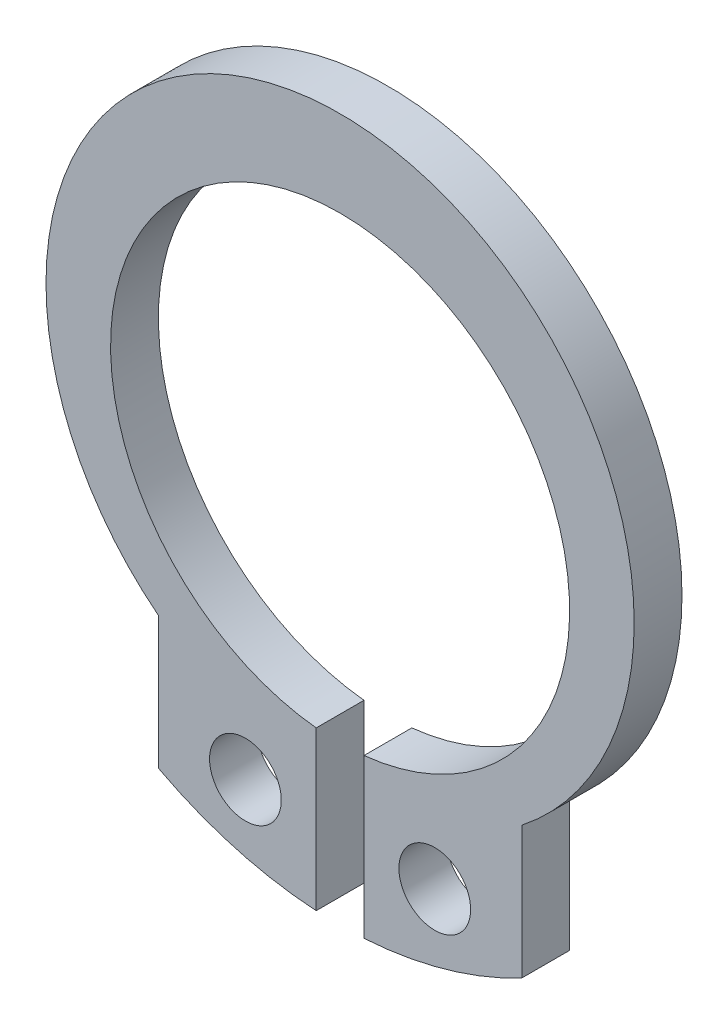
ISO-10303-21;
HEADER;
FILE_DESCRIPTION(('STEP AP214'),'2;1');
FILE_NAME('part.step','',(''),(''),'','','');
FILE_SCHEMA(('AUTOMOTIVE_DESIGN { 1 0 10303 214 1 1 1 1 }'));
ENDSEC;
DATA;
#1=APPLICATION_CONTEXT('core data for automotive mechanical design processes');
#2=APPLICATION_PROTOCOL_DEFINITION('international standard','automotive_design',2000,#1);
#3=PRODUCT_CONTEXT('',#1,'mechanical');
#4=PRODUCT('Part','Part','',(#3));
#5=PRODUCT_RELATED_PRODUCT_CATEGORY('part','',(#4));
#6=PRODUCT_DEFINITION_FORMATION('','',#4);
#7=PRODUCT_DEFINITION_CONTEXT('part definition',#1,'design');
#8=PRODUCT_DEFINITION('design','',#6,#7);
#9=PRODUCT_DEFINITION_SHAPE('','',#8);
#10=(LENGTH_UNIT() NAMED_UNIT(*) SI_UNIT(.MILLI.,.METRE.));
#11=(NAMED_UNIT(*) PLANE_ANGLE_UNIT() SI_UNIT($,.RADIAN.));
#12=(NAMED_UNIT(*) SI_UNIT($,.STERADIAN.) SOLID_ANGLE_UNIT());
#13=UNCERTAINTY_MEASURE_WITH_UNIT(LENGTH_MEASURE(1.E-05),#10,'distance_accuracy_value','');
#14=(GEOMETRIC_REPRESENTATION_CONTEXT(3) GLOBAL_UNCERTAINTY_ASSIGNED_CONTEXT((#13)) GLOBAL_UNIT_ASSIGNED_CONTEXT((#10,
#11,#12)) REPRESENTATION_CONTEXT('',''));
#15=CARTESIAN_POINT('',(0.,0.,0.));
#16=DIRECTION('',(0.,0.,1.));
#17=DIRECTION('',(1.,0.,0.));
#18=AXIS2_PLACEMENT_3D('',#15,#16,#17);
#19=CARTESIAN_POINT('',(0.,0.,0.));
#20=DIRECTION('',(0.,0.,1.));
#21=DIRECTION('',(1.,0.,0.));
#22=AXIS2_PLACEMENT_3D('',#19,#20,#21);
#23=CYLINDRICAL_SURFACE('',#22,8.1);
#24=CARTESIAN_POINT('',(0.,0.,1.));
#25=DIRECTION('',(0.,0.,1.));
#26=DIRECTION('',(1.,0.,0.));
#27=AXIS2_PLACEMENT_3D('',#24,#25,#26);
#28=CIRCLE('',#27,8.1);
#29=CARTESIAN_POINT('',(-3.8,-7.15332090710322,1.));
#30=VERTEX_POINT('',#29);
#31=CARTESIAN_POINT('',(-0.5,-8.08455317256309,1.));
#32=VERTEX_POINT('',#31);
#33=EDGE_CURVE('E142',#30,#32,#28,.T.);
#34=ORIENTED_EDGE('',*,*,#33,.F.);
#35=DIRECTION('',(0.,0.,1.));
#36=VECTOR('',#35,1.);
#37=CARTESIAN_POINT('',(-3.8,-7.15332090710322,0.));
#38=LINE('',#37,#36);
#39=CARTESIAN_POINT('',(-3.8,-7.15332090710322,0.));
#40=VERTEX_POINT('',#39);
#41=EDGE_CURVE('E11',#40,#30,#38,.T.);
#42=ORIENTED_EDGE('',*,*,#41,.F.);
#43=CARTESIAN_POINT('',(0.,0.,0.));
#44=DIRECTION('',(0.,0.,1.));
#45=DIRECTION('',(1.,0.,0.));
#46=AXIS2_PLACEMENT_3D('',#43,#44,#45);
#47=CIRCLE('',#46,8.1);
#48=CARTESIAN_POINT('',(-0.5,-8.08455317256309,0.));
#49=VERTEX_POINT('',#48);
#50=EDGE_CURVE('E163',#40,#49,#47,.T.);
#51=ORIENTED_EDGE('',*,*,#50,.T.);
#52=DIRECTION('',(0.,0.,1.));
#53=VECTOR('',#52,1.);
#54=CARTESIAN_POINT('',(-0.5,-8.08455317256309,0.));
#55=LINE('',#54,#53);
#56=EDGE_CURVE('E48',#49,#32,#55,.T.);
#57=ORIENTED_EDGE('',*,*,#56,.T.);
#58=EDGE_LOOP('',(#34,#42,#51,#57));
#59=FACE_BOUND('',#58,.T.);
#60=ADVANCED_FACE('F45',(#59),#23,.T.);
#61=CARTESIAN_POINT('',(-3.8,-4.38554547078197,0.));
#62=DIRECTION('',(-1.,0.,0.));
#63=DIRECTION('',(0.,0.,1.));
#64=AXIS2_PLACEMENT_3D('',#61,#62,#63);
#65=PLANE('',#64);
#66=DIRECTION('',(0.,-1.,0.));
#67=VECTOR('',#66,1.);
#68=CARTESIAN_POINT('',(-3.8,-4.38554547078197,1.));
#69=LINE('',#68,#67);
#70=CARTESIAN_POINT('',(-3.8,-4.38554547078197,1.));
#71=VERTEX_POINT('',#70);
#72=EDGE_CURVE('E161',#71,#30,#69,.T.);
#73=ORIENTED_EDGE('',*,*,#72,.F.);
#74=DIRECTION('',(0.,0.,1.));
#75=VECTOR('',#74,1.);
#76=CARTESIAN_POINT('',(-3.8,-4.38554547078197,0.));
#77=LINE('',#76,#75);
#78=CARTESIAN_POINT('',(-3.8,-4.38554547078197,0.));
#79=VERTEX_POINT('',#78);
#80=EDGE_CURVE('E54',#79,#71,#77,.T.);
#81=ORIENTED_EDGE('',*,*,#80,.F.);
#82=DIRECTION('',(0.,-1.,0.));
#83=VECTOR('',#82,1.);
#84=CARTESIAN_POINT('',(-3.8,-4.38554547078197,0.));
#85=LINE('',#84,#83);
#86=EDGE_CURVE('E132',#79,#40,#85,.T.);
#87=ORIENTED_EDGE('',*,*,#86,.T.);
#88=ORIENTED_EDGE('',*,*,#41,.T.);
#89=EDGE_LOOP('',(#73,#81,#87,#88));
#90=FACE_BOUND('',#89,.T.);
#91=ADVANCED_FACE('F175',(#90),#65,.T.);
#92=CARTESIAN_POINT('',(0.,0.45,0.));
#93=DIRECTION('',(0.,0.,1.));
#94=DIRECTION('',(1.,0.,0.));
#95=AXIS2_PLACEMENT_3D('',#92,#93,#94);
#96=CYLINDRICAL_SURFACE('',#95,6.15);
#97=CARTESIAN_POINT('',(0.,0.45,1.));
#98=DIRECTION('',(0.,0.,1.));
#99=DIRECTION('',(1.,0.,0.));
#100=AXIS2_PLACEMENT_3D('',#97,#98,#99);
#101=CIRCLE('',#100,6.15);
#102=CARTESIAN_POINT('',(3.8,-4.38554547078197,1.));
#103=VERTEX_POINT('',#102);
#104=EDGE_CURVE('E119',#103,#71,#101,.T.);
#105=ORIENTED_EDGE('',*,*,#104,.F.);
#106=DIRECTION('',(0.,0.,1.));
#107=VECTOR('',#106,1.);
#108=CARTESIAN_POINT('',(3.8,-4.38554547078197,0.));
#109=LINE('',#108,#107);
#110=CARTESIAN_POINT('',(3.8,-4.38554547078197,0.));
#111=VERTEX_POINT('',#110);
#112=EDGE_CURVE('E114',#111,#103,#109,.T.);
#113=ORIENTED_EDGE('',*,*,#112,.F.);
#114=CARTESIAN_POINT('',(0.,0.45,0.));
#115=DIRECTION('',(0.,0.,1.));
#116=DIRECTION('',(1.,0.,0.));
#117=AXIS2_PLACEMENT_3D('',#114,#115,#116);
#118=CIRCLE('',#117,6.15);
#119=EDGE_CURVE('E117',#111,#79,#118,.T.);
#120=ORIENTED_EDGE('',*,*,#119,.T.);
#121=ORIENTED_EDGE('',*,*,#80,.T.);
#122=EDGE_LOOP('',(#105,#113,#120,#121));
#123=FACE_BOUND('',#122,.T.);
#124=ADVANCED_FACE('F116',(#123),#96,.T.);
#125=CARTESIAN_POINT('',(3.8,-7.15332090710322,0.));
#126=DIRECTION('',(1.,0.,0.));
#127=DIRECTION('',(0.,0.,-1.));
#128=AXIS2_PLACEMENT_3D('',#125,#126,#127);
#129=PLANE('',#128);
#130=DIRECTION('',(0.,1.,0.));
#131=VECTOR('',#130,1.);
#132=CARTESIAN_POINT('',(3.8,-7.15332090710322,1.));
#133=LINE('',#132,#131);
#134=CARTESIAN_POINT('',(3.8,-7.15332090710322,1.));
#135=VERTEX_POINT('',#134);
#136=EDGE_CURVE('E158',#135,#103,#133,.T.);
#137=ORIENTED_EDGE('',*,*,#136,.F.);
#138=DIRECTION('',(0.,0.,1.));
#139=VECTOR('',#138,1.);
#140=CARTESIAN_POINT('',(3.8,-7.15332090710322,0.));
#141=LINE('',#140,#139);
#142=CARTESIAN_POINT('',(3.8,-7.15332090710322,0.));
#143=VERTEX_POINT('',#142);
#144=EDGE_CURVE('E124',#143,#135,#141,.T.);
#145=ORIENTED_EDGE('',*,*,#144,.F.);
#146=DIRECTION('',(0.,1.,0.));
#147=VECTOR('',#146,1.);
#148=CARTESIAN_POINT('',(3.8,-7.15332090710322,0.));
#149=LINE('',#148,#147);
#150=EDGE_CURVE('E130',#143,#111,#149,.T.);
#151=ORIENTED_EDGE('',*,*,#150,.T.);
#152=ORIENTED_EDGE('',*,*,#112,.T.);
#153=EDGE_LOOP('',(#137,#145,#151,#152));
#154=FACE_BOUND('',#153,.T.);
#155=ADVANCED_FACE('F134',(#154),#129,.T.);
#156=CARTESIAN_POINT('',(0.,0.,0.));
#157=DIRECTION('',(0.,0.,1.));
#158=DIRECTION('',(1.,0.,0.));
#159=AXIS2_PLACEMENT_3D('',#156,#157,#158);
#160=CYLINDRICAL_SURFACE('',#159,8.1);
#161=CARTESIAN_POINT('',(0.,0.,1.));
#162=DIRECTION('',(0.,0.,1.));
#163=DIRECTION('',(1.,0.,0.));
#164=AXIS2_PLACEMENT_3D('',#161,#162,#163);
#165=CIRCLE('',#164,8.1);
#166=CARTESIAN_POINT('',(0.5,-8.08455317256309,1.));
#167=VERTEX_POINT('',#166);
#168=EDGE_CURVE('E155',#167,#135,#165,.T.);
#169=ORIENTED_EDGE('',*,*,#168,.F.);
#170=DIRECTION('',(0.,0.,1.));
#171=VECTOR('',#170,1.);
#172=CARTESIAN_POINT('',(0.5,-8.08455317256309,0.));
#173=LINE('',#172,#171);
#174=CARTESIAN_POINT('',(0.5,-8.08455317256309,0.));
#175=VERTEX_POINT('',#174);
#176=EDGE_CURVE('E167',#175,#167,#173,.T.);
#177=ORIENTED_EDGE('',*,*,#176,.F.);
#178=CARTESIAN_POINT('',(0.,0.,0.));
#179=DIRECTION('',(0.,0.,1.));
#180=DIRECTION('',(1.,0.,0.));
#181=AXIS2_PLACEMENT_3D('',#178,#179,#180);
#182=CIRCLE('',#181,8.1);
#183=EDGE_CURVE('E135',#175,#143,#182,.T.);
#184=ORIENTED_EDGE('',*,*,#183,.T.);
#185=ORIENTED_EDGE('',*,*,#144,.T.);
#186=EDGE_LOOP('',(#169,#177,#184,#185));
#187=FACE_BOUND('',#186,.T.);
#188=ADVANCED_FACE('F188',(#187),#160,.T.);
#189=CARTESIAN_POINT('',(0.5,-4.773887304912,0.));
#190=DIRECTION('',(-1.,0.,0.));
#191=DIRECTION('',(0.,0.,1.));
#192=AXIS2_PLACEMENT_3D('',#189,#190,#191);
#193=PLANE('',#192);
#194=DIRECTION('',(0.,-1.,0.));
#195=VECTOR('',#194,1.);
#196=CARTESIAN_POINT('',(0.5,-4.773887304912,1.));
#197=LINE('',#196,#195);
#198=CARTESIAN_POINT('',(0.500000000000002,-4.773887304912,1.));
#199=VERTEX_POINT('',#198);
#200=EDGE_CURVE('E152',#199,#167,#197,.T.);
#201=ORIENTED_EDGE('',*,*,#200,.F.);
#202=DIRECTION('',(0.,0.,1.));
#203=VECTOR('',#202,1.);
#204=CARTESIAN_POINT('',(0.500000000000002,-4.773887304912,0.));
#205=LINE('',#204,#203);
#206=CARTESIAN_POINT('',(0.500000000000002,-4.773887304912,0.));
#207=VERTEX_POINT('',#206);
#208=EDGE_CURVE('E169',#207,#199,#205,.T.);
#209=ORIENTED_EDGE('',*,*,#208,.F.);
#210=DIRECTION('',(0.,-1.,0.));
#211=VECTOR('',#210,1.);
#212=CARTESIAN_POINT('',(0.5,-4.773887304912,0.));
#213=LINE('',#212,#211);
#214=EDGE_CURVE('E137',#207,#175,#213,.T.);
#215=ORIENTED_EDGE('',*,*,#214,.T.);
#216=ORIENTED_EDGE('',*,*,#176,.T.);
#217=EDGE_LOOP('',(#201,#209,#215,#216));
#218=FACE_BOUND('',#217,.T.);
#219=ADVANCED_FACE('F191',(#218),#193,.T.);
#220=CARTESIAN_POINT('',(0.,0.,0.));
#221=DIRECTION('',(0.,0.,1.));
#222=DIRECTION('',(1.,0.,0.));
#223=AXIS2_PLACEMENT_3D('',#220,#221,#222);
#224=CYLINDRICAL_SURFACE('',#223,4.8);
#225=CARTESIAN_POINT('',(0.,0.,1.));
#226=DIRECTION('',(0.,0.,-1.));
#227=DIRECTION('',(-1.,0.,0.));
#228=AXIS2_PLACEMENT_3D('',#225,#226,#227);
#229=CIRCLE('',#228,4.8);
#230=CARTESIAN_POINT('',(-0.5,-4.773887304912,1.));
#231=VERTEX_POINT('',#230);
#232=EDGE_CURVE('E149',#231,#199,#229,.T.);
#233=ORIENTED_EDGE('',*,*,#232,.F.);
#234=DIRECTION('',(0.,0.,1.));
#235=VECTOR('',#234,1.);
#236=CARTESIAN_POINT('',(-0.5,-4.773887304912,0.));
#237=LINE('',#236,#235);
#238=CARTESIAN_POINT('',(-0.5,-4.773887304912,0.));
#239=VERTEX_POINT('',#238);
#240=EDGE_CURVE('E170',#239,#231,#237,.T.);
#241=ORIENTED_EDGE('',*,*,#240,.F.);
#242=CARTESIAN_POINT('',(0.,0.,0.));
#243=DIRECTION('',(0.,0.,-1.));
#244=DIRECTION('',(-1.,0.,0.));
#245=AXIS2_PLACEMENT_3D('',#242,#243,#244);
#246=CIRCLE('',#245,4.8);
#247=EDGE_CURVE('E237',#239,#207,#246,.T.);
#248=ORIENTED_EDGE('',*,*,#247,.T.);
#249=ORIENTED_EDGE('',*,*,#208,.T.);
#250=EDGE_LOOP('',(#233,#241,#248,#249));
#251=FACE_BOUND('',#250,.T.);
#252=ADVANCED_FACE('F195',(#251),#224,.F.);
#253=CARTESIAN_POINT('',(-0.5,-8.08455317256309,0.));
#254=DIRECTION('',(1.,0.,0.));
#255=DIRECTION('',(0.,0.,-1.));
#256=AXIS2_PLACEMENT_3D('',#253,#254,#255);
#257=PLANE('',#256);
#258=DIRECTION('',(0.,1.,0.));
#259=VECTOR('',#258,1.);
#260=CARTESIAN_POINT('',(-0.5,-8.08455317256309,1.));
#261=LINE('',#260,#259);
#262=EDGE_CURVE('E145',#32,#231,#261,.T.);
#263=ORIENTED_EDGE('',*,*,#262,.F.);
#264=ORIENTED_EDGE('',*,*,#56,.F.);
#265=DIRECTION('',(0.,1.,0.));
#266=VECTOR('',#265,1.);
#267=CARTESIAN_POINT('',(-0.5,-8.08455317256309,0.));
#268=LINE('',#267,#266);
#269=EDGE_CURVE('E235',#49,#239,#268,.T.);
#270=ORIENTED_EDGE('',*,*,#269,.T.);
#271=ORIENTED_EDGE('',*,*,#240,.T.);
#272=EDGE_LOOP('',(#263,#264,#270,#271));
#273=FACE_BOUND('',#272,.T.);
#274=ADVANCED_FACE('F172',(#273),#257,.T.);
#275=CARTESIAN_POINT('',(0.,0.,0.));
#276=DIRECTION('',(0.,0.,1.));
#277=DIRECTION('',(1.,0.,0.));
#278=AXIS2_PLACEMENT_3D('',#275,#276,#277);
#279=PLANE('',#278);
#280=CARTESIAN_POINT('',(-1.98,-6.45,0.));
#281=DIRECTION('',(0.,0.,1.));
#282=DIRECTION('',(-1.,0.,0.));
#283=AXIS2_PLACEMENT_3D('',#280,#281,#282);
#284=CIRCLE('',#283,0.75);
#285=CARTESIAN_POINT('',(-2.73,-6.45,0.));
#286=VERTEX_POINT('',#285);
#287=EDGE_CURVE('E222',#286,#286,#284,.T.);
#288=ORIENTED_EDGE('',*,*,#287,.T.);
#289=EDGE_LOOP('',(#288));
#290=FACE_BOUND('',#289,.T.);
#291=CARTESIAN_POINT('',(1.98,-6.45,0.));
#292=DIRECTION('',(0.,0.,1.));
#293=DIRECTION('',(-1.,0.,0.));
#294=AXIS2_PLACEMENT_3D('',#291,#292,#293);
#295=CIRCLE('',#294,0.75);
#296=CARTESIAN_POINT('',(1.23,-6.45,0.));
#297=VERTEX_POINT('',#296);
#298=EDGE_CURVE('E146',#297,#297,#295,.T.);
#299=ORIENTED_EDGE('',*,*,#298,.T.);
#300=EDGE_LOOP('',(#299));
#301=FACE_BOUND('',#300,.T.);
#302=ORIENTED_EDGE('',*,*,#50,.F.);
#303=ORIENTED_EDGE('',*,*,#86,.F.);
#304=ORIENTED_EDGE('',*,*,#119,.F.);
#305=ORIENTED_EDGE('',*,*,#150,.F.);
#306=ORIENTED_EDGE('',*,*,#183,.F.);
#307=ORIENTED_EDGE('',*,*,#214,.F.);
#308=ORIENTED_EDGE('',*,*,#247,.F.);
#309=ORIENTED_EDGE('',*,*,#269,.F.);
#310=EDGE_LOOP('',(#302,#303,#304,#305,#306,#307,#308,#309));
#311=FACE_BOUND('',#310,.T.);
#312=ADVANCED_FACE('F128',(#290,#301,#311),#279,.F.);
#313=CARTESIAN_POINT('',(0.,0.,1.));
#314=DIRECTION('',(0.,0.,1.));
#315=DIRECTION('',(1.,0.,0.));
#316=AXIS2_PLACEMENT_3D('',#313,#314,#315);
#317=PLANE('',#316);
#318=CARTESIAN_POINT('',(-1.98,-6.45,1.));
#319=DIRECTION('',(0.,0.,1.));
#320=DIRECTION('',(-1.,0.,0.));
#321=AXIS2_PLACEMENT_3D('',#318,#319,#320);
#322=CIRCLE('',#321,0.75);
#323=CARTESIAN_POINT('',(-2.73,-6.45,1.));
#324=VERTEX_POINT('',#323);
#325=EDGE_CURVE('E225',#324,#324,#322,.T.);
#326=ORIENTED_EDGE('',*,*,#325,.F.);
#327=EDGE_LOOP('',(#326));
#328=FACE_BOUND('',#327,.T.);
#329=CARTESIAN_POINT('',(1.98,-6.45,1.));
#330=DIRECTION('',(0.,0.,1.));
#331=DIRECTION('',(-1.,0.,0.));
#332=AXIS2_PLACEMENT_3D('',#329,#330,#331);
#333=CIRCLE('',#332,0.75);
#334=CARTESIAN_POINT('',(1.23,-6.45,1.));
#335=VERTEX_POINT('',#334);
#336=EDGE_CURVE('E227',#335,#335,#333,.T.);
#337=ORIENTED_EDGE('',*,*,#336,.F.);
#338=EDGE_LOOP('',(#337));
#339=FACE_BOUND('',#338,.T.);
#340=ORIENTED_EDGE('',*,*,#33,.T.);
#341=ORIENTED_EDGE('',*,*,#262,.T.);
#342=ORIENTED_EDGE('',*,*,#232,.T.);
#343=ORIENTED_EDGE('',*,*,#200,.T.);
#344=ORIENTED_EDGE('',*,*,#168,.T.);
#345=ORIENTED_EDGE('',*,*,#136,.T.);
#346=ORIENTED_EDGE('',*,*,#104,.T.);
#347=ORIENTED_EDGE('',*,*,#72,.T.);
#348=EDGE_LOOP('',(#340,#341,#342,#343,#344,#345,#346,#347));
#349=FACE_BOUND('',#348,.T.);
#350=ADVANCED_FACE('F174',(#328,#339,#349),#317,.T.);
#351=CARTESIAN_POINT('',(1.98,-6.45,0.));
#352=DIRECTION('',(0.,0.,1.));
#353=DIRECTION('',(1.,0.,0.));
#354=AXIS2_PLACEMENT_3D('',#351,#352,#353);
#355=CYLINDRICAL_SURFACE('',#354,0.75);
#356=ORIENTED_EDGE('',*,*,#298,.F.);
#357=EDGE_LOOP('',(#356));
#358=FACE_BOUND('',#357,.T.);
#359=ORIENTED_EDGE('',*,*,#336,.T.);
#360=EDGE_LOOP('',(#359));
#361=FACE_BOUND('',#360,.T.);
#362=ADVANCED_FACE('F207',(#358,#361),#355,.F.);
#363=CARTESIAN_POINT('',(-1.98,-6.45,0.));
#364=DIRECTION('',(0.,0.,1.));
#365=DIRECTION('',(1.,0.,0.));
#366=AXIS2_PLACEMENT_3D('',#363,#364,#365);
#367=CYLINDRICAL_SURFACE('',#366,0.75);
#368=ORIENTED_EDGE('',*,*,#287,.F.);
#369=EDGE_LOOP('',(#368));
#370=FACE_BOUND('',#369,.T.);
#371=ORIENTED_EDGE('',*,*,#325,.T.);
#372=EDGE_LOOP('',(#371));
#373=FACE_BOUND('',#372,.T.);
#374=ADVANCED_FACE('F214',(#370,#373),#367,.F.);
#375=CLOSED_SHELL('',(#60,#91,#124,#155,#188,#219,#252,#274,#312,#350,#362,#374));
#376=MANIFOLD_SOLID_BREP('B2',#375);
#377=ADVANCED_BREP_SHAPE_REPRESENTATION('',(#18,#376),#14);
#378=SHAPE_DEFINITION_REPRESENTATION(#9,#377);
ENDSEC;
END-ISO-10303-21;
